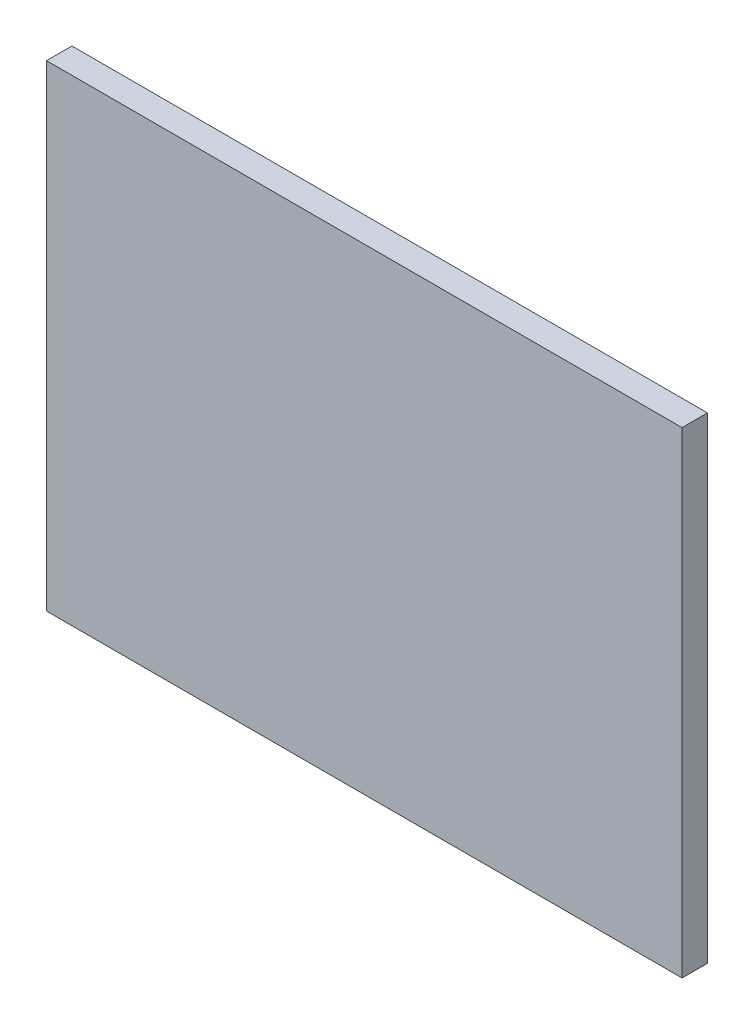
ISO-10303-21;
HEADER;
FILE_DESCRIPTION(('STEP AP214'),'2;1');
FILE_NAME('part.step','',(''),(''),'','','');
FILE_SCHEMA(('AUTOMOTIVE_DESIGN { 1 0 10303 214 1 1 1 1 }'));
ENDSEC;
DATA;
#1=APPLICATION_CONTEXT('core data for automotive mechanical design processes');
#2=APPLICATION_PROTOCOL_DEFINITION('international standard','automotive_design',2000,#1);
#3=PRODUCT_CONTEXT('',#1,'mechanical');
#4=PRODUCT('Part','Part','',(#3));
#5=PRODUCT_RELATED_PRODUCT_CATEGORY('part','',(#4));
#6=PRODUCT_DEFINITION_FORMATION('','',#4);
#7=PRODUCT_DEFINITION_CONTEXT('part definition',#1,'design');
#8=PRODUCT_DEFINITION('design','',#6,#7);
#9=PRODUCT_DEFINITION_SHAPE('','',#8);
#10=(LENGTH_UNIT() NAMED_UNIT(*) SI_UNIT(.MILLI.,.METRE.));
#11=(NAMED_UNIT(*) PLANE_ANGLE_UNIT() SI_UNIT($,.RADIAN.));
#12=(NAMED_UNIT(*) SI_UNIT($,.STERADIAN.) SOLID_ANGLE_UNIT());
#13=UNCERTAINTY_MEASURE_WITH_UNIT(LENGTH_MEASURE(1.E-05),#10,'distance_accuracy_value','');
#14=(GEOMETRIC_REPRESENTATION_CONTEXT(3) GLOBAL_UNCERTAINTY_ASSIGNED_CONTEXT((#13)) GLOBAL_UNIT_ASSIGNED_CONTEXT((#10,
#11,#12)) REPRESENTATION_CONTEXT('',''));
#15=CARTESIAN_POINT('',(0.,0.,0.));
#16=DIRECTION('',(0.,0.,1.));
#17=DIRECTION('',(1.,0.,0.));
#18=AXIS2_PLACEMENT_3D('',#15,#16,#17);
#19=CARTESIAN_POINT('',(80.,60.,3.2));
#20=DIRECTION('',(-1.,0.,0.));
#21=DIRECTION('',(0.,0.,1.));
#22=AXIS2_PLACEMENT_3D('',#19,#20,#21);
#23=PLANE('',#22);
#24=DIRECTION('',(0.,1.,0.));
#25=VECTOR('',#24,1.);
#26=CARTESIAN_POINT('',(80.,60.,0.));
#27=LINE('',#26,#25);
#28=CARTESIAN_POINT('',(80.,0.,0.));
#29=VERTEX_POINT('',#28);
#30=CARTESIAN_POINT('',(80.,60.,0.));
#31=VERTEX_POINT('',#30);
#32=EDGE_CURVE('E100',#29,#31,#27,.T.);
#33=ORIENTED_EDGE('',*,*,#32,.T.);
#34=DIRECTION('',(0.,0.,-1.));
#35=VECTOR('',#34,1.);
#36=CARTESIAN_POINT('',(80.,60.,3.2));
#37=LINE('',#36,#35);
#38=CARTESIAN_POINT('',(80.,60.,3.2));
#39=VERTEX_POINT('',#38);
#40=EDGE_CURVE('E11',#39,#31,#37,.T.);
#41=ORIENTED_EDGE('',*,*,#40,.F.);
#42=DIRECTION('',(0.,1.,0.));
#43=VECTOR('',#42,1.);
#44=CARTESIAN_POINT('',(80.,60.,3.2));
#45=LINE('',#44,#43);
#46=CARTESIAN_POINT('',(80.,0.,3.2));
#47=VERTEX_POINT('',#46);
#48=EDGE_CURVE('E88',#47,#39,#45,.T.);
#49=ORIENTED_EDGE('',*,*,#48,.F.);
#50=DIRECTION('',(0.,0.,-1.));
#51=VECTOR('',#50,1.);
#52=CARTESIAN_POINT('',(80.,0.,3.2));
#53=LINE('',#52,#51);
#54=EDGE_CURVE('E96',#47,#29,#53,.T.);
#55=ORIENTED_EDGE('',*,*,#54,.T.);
#56=EDGE_LOOP('',(#33,#41,#49,#55));
#57=FACE_BOUND('',#56,.T.);
#58=ADVANCED_FACE('F37',(#57),#23,.F.);
#59=CARTESIAN_POINT('',(80.,60.,3.2));
#60=DIRECTION('',(0.,-1.,0.));
#61=DIRECTION('',(1.,0.,0.));
#62=AXIS2_PLACEMENT_3D('',#59,#60,#61);
#63=PLANE('',#62);
#64=DIRECTION('',(-1.,0.,0.));
#65=VECTOR('',#64,1.);
#66=CARTESIAN_POINT('',(80.,60.,0.));
#67=LINE('',#66,#65);
#68=CARTESIAN_POINT('',(0.,60.,0.));
#69=VERTEX_POINT('',#68);
#70=EDGE_CURVE('E92',#31,#69,#67,.T.);
#71=ORIENTED_EDGE('',*,*,#70,.T.);
#72=DIRECTION('',(0.,0.,-1.));
#73=VECTOR('',#72,1.);
#74=CARTESIAN_POINT('',(0.,60.,3.2));
#75=LINE('',#74,#73);
#76=CARTESIAN_POINT('',(0.,60.,3.2));
#77=VERTEX_POINT('',#76);
#78=EDGE_CURVE('E45',#77,#69,#75,.T.);
#79=ORIENTED_EDGE('',*,*,#78,.F.);
#80=DIRECTION('',(-1.,0.,0.));
#81=VECTOR('',#80,1.);
#82=CARTESIAN_POINT('',(80.,60.,3.2));
#83=LINE('',#82,#81);
#84=EDGE_CURVE('E83',#39,#77,#83,.T.);
#85=ORIENTED_EDGE('',*,*,#84,.F.);
#86=ORIENTED_EDGE('',*,*,#40,.T.);
#87=EDGE_LOOP('',(#71,#79,#85,#86));
#88=FACE_BOUND('',#87,.T.);
#89=ADVANCED_FACE('F91',(#88),#63,.F.);
#90=CARTESIAN_POINT('',(0.,60.,3.2));
#91=DIRECTION('',(1.,0.,0.));
#92=DIRECTION('',(0.,1.,0.));
#93=AXIS2_PLACEMENT_3D('',#90,#91,#92);
#94=PLANE('',#93);
#95=DIRECTION('',(0.,-1.,0.));
#96=VECTOR('',#95,1.);
#97=CARTESIAN_POINT('',(0.,60.,0.));
#98=LINE('',#97,#96);
#99=CARTESIAN_POINT('',(0.,0.,0.));
#100=VERTEX_POINT('',#99);
#101=EDGE_CURVE('E70',#69,#100,#98,.T.);
#102=ORIENTED_EDGE('',*,*,#101,.T.);
#103=DIRECTION('',(0.,0.,-1.));
#104=VECTOR('',#103,1.);
#105=CARTESIAN_POINT('',(0.,0.,3.2));
#106=LINE('',#105,#104);
#107=CARTESIAN_POINT('',(0.,0.,3.2));
#108=VERTEX_POINT('',#107);
#109=EDGE_CURVE('E93',#108,#100,#106,.T.);
#110=ORIENTED_EDGE('',*,*,#109,.F.);
#111=DIRECTION('',(0.,-1.,0.));
#112=VECTOR('',#111,1.);
#113=CARTESIAN_POINT('',(0.,60.,3.2));
#114=LINE('',#113,#112);
#115=EDGE_CURVE('E86',#77,#108,#114,.T.);
#116=ORIENTED_EDGE('',*,*,#115,.F.);
#117=ORIENTED_EDGE('',*,*,#78,.T.);
#118=EDGE_LOOP('',(#102,#110,#116,#117));
#119=FACE_BOUND('',#118,.T.);
#120=ADVANCED_FACE('F94',(#119),#94,.F.);
#121=CARTESIAN_POINT('',(80.,0.,3.2));
#122=DIRECTION('',(0.,1.,0.));
#123=DIRECTION('',(0.,0.,1.));
#124=AXIS2_PLACEMENT_3D('',#121,#122,#123);
#125=PLANE('',#124);
#126=DIRECTION('',(1.,0.,0.));
#127=VECTOR('',#126,1.);
#128=CARTESIAN_POINT('',(80.,0.,0.));
#129=LINE('',#128,#127);
#130=EDGE_CURVE('E76',#100,#29,#129,.T.);
#131=ORIENTED_EDGE('',*,*,#130,.T.);
#132=ORIENTED_EDGE('',*,*,#54,.F.);
#133=DIRECTION('',(1.,0.,0.));
#134=VECTOR('',#133,1.);
#135=CARTESIAN_POINT('',(80.,0.,3.2));
#136=LINE('',#135,#134);
#137=EDGE_CURVE('E53',#108,#47,#136,.T.);
#138=ORIENTED_EDGE('',*,*,#137,.F.);
#139=ORIENTED_EDGE('',*,*,#109,.T.);
#140=EDGE_LOOP('',(#131,#132,#138,#139));
#141=FACE_BOUND('',#140,.T.);
#142=ADVANCED_FACE('F107',(#141),#125,.F.);
#143=CARTESIAN_POINT('',(0.,0.,3.2));
#144=DIRECTION('',(0.,0.,-1.));
#145=DIRECTION('',(-1.,0.,0.));
#146=AXIS2_PLACEMENT_3D('',#143,#144,#145);
#147=PLANE('',#146);
#148=ORIENTED_EDGE('',*,*,#48,.T.);
#149=ORIENTED_EDGE('',*,*,#84,.T.);
#150=ORIENTED_EDGE('',*,*,#115,.T.);
#151=ORIENTED_EDGE('',*,*,#137,.T.);
#152=EDGE_LOOP('',(#148,#149,#150,#151));
#153=FACE_BOUND('',#152,.T.);
#154=ADVANCED_FACE('F84',(#153),#147,.F.);
#155=CARTESIAN_POINT('',(0.,0.,0.));
#156=DIRECTION('',(0.,0.,-1.));
#157=DIRECTION('',(-1.,0.,0.));
#158=AXIS2_PLACEMENT_3D('',#155,#156,#157);
#159=PLANE('',#158);
#160=ORIENTED_EDGE('',*,*,#32,.F.);
#161=ORIENTED_EDGE('',*,*,#130,.F.);
#162=ORIENTED_EDGE('',*,*,#101,.F.);
#163=ORIENTED_EDGE('',*,*,#70,.F.);
#164=EDGE_LOOP('',(#160,#161,#162,#163));
#165=FACE_BOUND('',#164,.T.);
#166=ADVANCED_FACE('F110',(#165),#159,.T.);
#167=CLOSED_SHELL('',(#58,#89,#120,#142,#154,#166));
#168=MANIFOLD_SOLID_BREP('B2',#167);
#169=ADVANCED_BREP_SHAPE_REPRESENTATION('',(#18,#168),#14);
#170=SHAPE_DEFINITION_REPRESENTATION(#9,#169);
ENDSEC;
END-ISO-10303-21;
